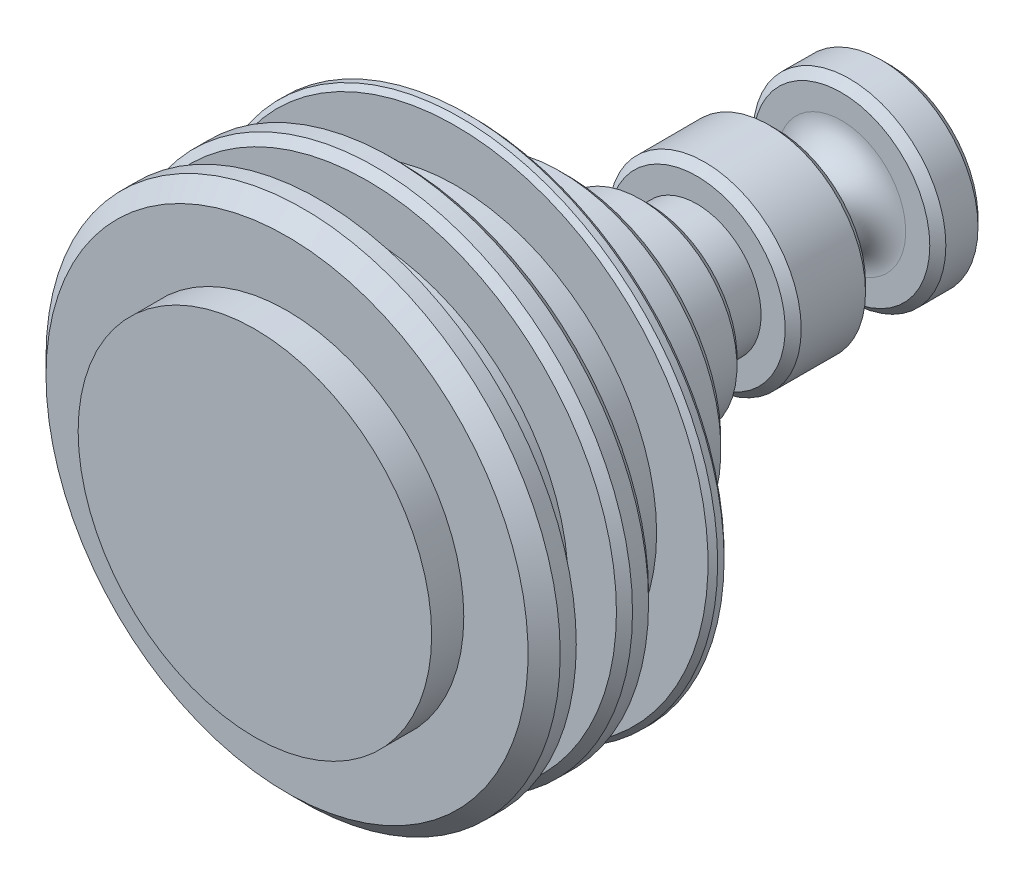
ISO-10303-21;
HEADER;
FILE_DESCRIPTION(('STEP AP214'),'2;1');
FILE_NAME('part.step','',(''),(''),'','','');
FILE_SCHEMA(('AUTOMOTIVE_DESIGN { 1 0 10303 214 1 1 1 1 }'));
ENDSEC;
DATA;
#1=APPLICATION_CONTEXT('core data for automotive mechanical design processes');
#2=APPLICATION_PROTOCOL_DEFINITION('international standard','automotive_design',2000,#1);
#3=PRODUCT_CONTEXT('',#1,'mechanical');
#4=PRODUCT('Part','Part','',(#3));
#5=PRODUCT_RELATED_PRODUCT_CATEGORY('part','',(#4));
#6=PRODUCT_DEFINITION_FORMATION('','',#4);
#7=PRODUCT_DEFINITION_CONTEXT('part definition',#1,'design');
#8=PRODUCT_DEFINITION('design','',#6,#7);
#9=PRODUCT_DEFINITION_SHAPE('','',#8);
#10=(LENGTH_UNIT() NAMED_UNIT(*) SI_UNIT(.MILLI.,.METRE.));
#11=(NAMED_UNIT(*) PLANE_ANGLE_UNIT() SI_UNIT($,.RADIAN.));
#12=(NAMED_UNIT(*) SI_UNIT($,.STERADIAN.) SOLID_ANGLE_UNIT());
#13=UNCERTAINTY_MEASURE_WITH_UNIT(LENGTH_MEASURE(1.E-05),#10,'distance_accuracy_value','');
#14=(GEOMETRIC_REPRESENTATION_CONTEXT(3) GLOBAL_UNCERTAINTY_ASSIGNED_CONTEXT((#13)) GLOBAL_UNIT_ASSIGNED_CONTEXT((#10,
#11,#12)) REPRESENTATION_CONTEXT('',''));
#15=CARTESIAN_POINT('',(0.,0.,0.));
#16=DIRECTION('',(0.,0.,1.));
#17=DIRECTION('',(1.,0.,0.));
#18=AXIS2_PLACEMENT_3D('',#15,#16,#17);
#19=CARTESIAN_POINT('',(-10.4857690202518,0.,-30.5));
#20=DIRECTION('',(0.,0.,1.));
#21=DIRECTION('',(1.,0.,0.));
#22=AXIS2_PLACEMENT_3D('',#19,#20,#21);
#23=PLANE('',#22);
#24=CARTESIAN_POINT('',(0.,0.,-30.5));
#25=DIRECTION('',(0.,0.,1.));
#26=DIRECTION('',(1.,0.,0.));
#27=AXIS2_PLACEMENT_3D('',#24,#25,#26);
#28=CIRCLE('',#27,5.5);
#29=CARTESIAN_POINT('',(5.5,0.,-30.5));
#30=VERTEX_POINT('',#29);
#31=EDGE_CURVE('E85',#30,#30,#28,.F.);
#32=ORIENTED_EDGE('',*,*,#31,.T.);
#33=EDGE_LOOP('',(#32));
#34=FACE_BOUND('',#33,.T.);
#35=CARTESIAN_POINT('',(0.,0.,-30.5));
#36=DIRECTION('',(0.,0.,-1.));
#37=DIRECTION('',(-1.,0.,0.));
#38=AXIS2_PLACEMENT_3D('',#35,#36,#37);
#39=CIRCLE('',#38,4.);
#40=CARTESIAN_POINT('',(-4.,0.,-30.5));
#41=VERTEX_POINT('',#40);
#42=EDGE_CURVE('E151',#41,#41,#39,.T.);
#43=ORIENTED_EDGE('',*,*,#42,.F.);
#44=EDGE_LOOP('',(#43));
#45=FACE_BOUND('',#44,.T.);
#46=ADVANCED_FACE('F41',(#34,#45),#23,.F.);
#47=CARTESIAN_POINT('',(-10.4857690202518,0.,-34.5));
#48=DIRECTION('',(0.,0.,1.));
#49=DIRECTION('',(1.,0.,0.));
#50=AXIS2_PLACEMENT_3D('',#47,#48,#49);
#51=PLANE('',#50);
#52=CARTESIAN_POINT('',(0.,0.,-34.5));
#53=DIRECTION('',(0.,0.,1.));
#54=DIRECTION('',(1.,0.,0.));
#55=AXIS2_PLACEMENT_3D('',#52,#53,#54);
#56=CIRCLE('',#55,5.49999999999999);
#57=CARTESIAN_POINT('',(5.49999999999999,0.,-34.5));
#58=VERTEX_POINT('',#57);
#59=EDGE_CURVE('E94',#58,#58,#56,.T.);
#60=ORIENTED_EDGE('',*,*,#59,.T.);
#61=EDGE_LOOP('',(#60));
#62=FACE_BOUND('',#61,.T.);
#63=CARTESIAN_POINT('',(0.,0.,-34.5));
#64=DIRECTION('',(0.,0.,-1.));
#65=DIRECTION('',(-1.,0.,0.));
#66=AXIS2_PLACEMENT_3D('',#63,#64,#65);
#67=CIRCLE('',#66,4.);
#68=CARTESIAN_POINT('',(-4.,0.,-34.5));
#69=VERTEX_POINT('',#68);
#70=EDGE_CURVE('E154',#69,#69,#67,.T.);
#71=ORIENTED_EDGE('',*,*,#70,.T.);
#72=EDGE_LOOP('',(#71));
#73=FACE_BOUND('',#72,.T.);
#74=ADVANCED_FACE('F158',(#62,#73),#51,.T.);
#75=CARTESIAN_POINT('',(0.,0.,-32.5));
#76=DIRECTION('',(0.,0.,-1.));
#77=DIRECTION('',(-1.,0.,0.));
#78=AXIS2_PLACEMENT_3D('',#75,#76,#77);
#79=TOROIDAL_SURFACE('',#78,4.,2.);
#80=ORIENTED_EDGE('',*,*,#42,.T.);
#81=EDGE_LOOP('',(#80));
#82=FACE_BOUND('',#81,.T.);
#83=ORIENTED_EDGE('',*,*,#70,.F.);
#84=EDGE_LOOP('',(#83));
#85=FACE_BOUND('',#84,.T.);
#86=ADVANCED_FACE('F160',(#82,#85),#79,.F.);
#87=CARTESIAN_POINT('',(0.,0.,-37.5));
#88=DIRECTION('',(0.,0.,-1.));
#89=DIRECTION('',(-1.,0.,0.));
#90=AXIS2_PLACEMENT_3D('',#87,#88,#89);
#91=PLANE('',#90);
#92=CARTESIAN_POINT('',(0.,0.,-37.5));
#93=DIRECTION('',(0.,0.,-1.));
#94=DIRECTION('',(-1.,0.,0.));
#95=AXIS2_PLACEMENT_3D('',#92,#93,#94);
#96=CIRCLE('',#95,5.49999999999999);
#97=CARTESIAN_POINT('',(-5.49999999999999,0.,-37.5));
#98=VERTEX_POINT('',#97);
#99=EDGE_CURVE('E103',#98,#98,#96,.T.);
#100=ORIENTED_EDGE('',*,*,#99,.T.);
#101=EDGE_LOOP('',(#100));
#102=FACE_BOUND('',#101,.T.);
#103=ADVANCED_FACE('F162',(#102),#91,.T.);
#104=CARTESIAN_POINT('',(0.,0.,-37.5));
#105=DIRECTION('',(0.,0.,1.));
#106=DIRECTION('',(1.,0.,0.));
#107=AXIS2_PLACEMENT_3D('',#104,#105,#106);
#108=CYLINDRICAL_SURFACE('',#107,6.);
#109=CARTESIAN_POINT('',(0.,0.,-37.));
#110=DIRECTION('',(0.,0.,-1.));
#111=DIRECTION('',(-1.,0.,0.));
#112=AXIS2_PLACEMENT_3D('',#109,#110,#111);
#113=CIRCLE('',#112,6.);
#114=CARTESIAN_POINT('',(-6.,0.,-37.));
#115=VERTEX_POINT('',#114);
#116=EDGE_CURVE('E97',#115,#115,#113,.F.);
#117=ORIENTED_EDGE('',*,*,#116,.T.);
#118=EDGE_LOOP('',(#117));
#119=FACE_BOUND('',#118,.T.);
#120=CARTESIAN_POINT('',(0.,0.,-35.));
#121=DIRECTION('',(0.,0.,1.));
#122=DIRECTION('',(1.,0.,0.));
#123=AXIS2_PLACEMENT_3D('',#120,#121,#122);
#124=CIRCLE('',#123,6.);
#125=CARTESIAN_POINT('',(6.,0.,-35.));
#126=VERTEX_POINT('',#125);
#127=EDGE_CURVE('E100',#126,#126,#124,.F.);
#128=ORIENTED_EDGE('',*,*,#127,.T.);
#129=EDGE_LOOP('',(#128));
#130=FACE_BOUND('',#129,.T.);
#131=ADVANCED_FACE('F169',(#119,#130),#108,.T.);
#132=CARTESIAN_POINT('',(0.,0.,-25.5));
#133=DIRECTION('',(0.,0.,-1.));
#134=DIRECTION('',(-1.,0.,0.));
#135=AXIS2_PLACEMENT_3D('',#132,#133,#134);
#136=PLANE('',#135);
#137=CARTESIAN_POINT('',(0.,0.,-25.5));
#138=DIRECTION('',(0.,0.,-1.));
#139=DIRECTION('',(-1.,0.,0.));
#140=AXIS2_PLACEMENT_3D('',#137,#138,#139);
#141=CIRCLE('',#140,5.5);
#142=CARTESIAN_POINT('',(-5.5,0.,-25.5));
#143=VERTEX_POINT('',#142);
#144=EDGE_CURVE('E82',#143,#143,#141,.F.);
#145=ORIENTED_EDGE('',*,*,#144,.T.);
#146=EDGE_LOOP('',(#145));
#147=FACE_BOUND('',#146,.T.);
#148=CARTESIAN_POINT('',(0.,0.,-25.5));
#149=DIRECTION('',(0.,0.,-1.));
#150=DIRECTION('',(-1.,0.,0.));
#151=AXIS2_PLACEMENT_3D('',#148,#149,#150);
#152=CIRCLE('',#151,4.);
#153=CARTESIAN_POINT('',(-4.,0.,-25.5));
#154=VERTEX_POINT('',#153);
#155=EDGE_CURVE('E145',#154,#154,#152,.T.);
#156=ORIENTED_EDGE('',*,*,#155,.T.);
#157=EDGE_LOOP('',(#156));
#158=FACE_BOUND('',#157,.T.);
#159=ADVANCED_FACE('F422',(#147,#158),#136,.F.);
#160=CARTESIAN_POINT('',(0.,0.,-30.));
#161=DIRECTION('',(0.,0.,1.));
#162=DIRECTION('',(1.,0.,0.));
#163=AXIS2_PLACEMENT_3D('',#160,#161,#162);
#164=CIRCLE('',#163,6.);
#165=CARTESIAN_POINT('',(6.,0.,-30.));
#166=VERTEX_POINT('',#165);
#167=EDGE_CURVE('E88',#166,#166,#164,.T.);
#168=ORIENTED_EDGE('',*,*,#167,.T.);
#169=EDGE_LOOP('',(#168));
#170=FACE_BOUND('',#169,.T.);
#171=CARTESIAN_POINT('',(0.,0.,-26.));
#172=DIRECTION('',(0.,0.,-1.));
#173=DIRECTION('',(-1.,0.,0.));
#174=AXIS2_PLACEMENT_3D('',#171,#172,#173);
#175=CIRCLE('',#174,6.);
#176=CARTESIAN_POINT('',(-6.,0.,-26.));
#177=VERTEX_POINT('',#176);
#178=EDGE_CURVE('E91',#177,#177,#175,.T.);
#179=ORIENTED_EDGE('',*,*,#178,.T.);
#180=EDGE_LOOP('',(#179));
#181=FACE_BOUND('',#180,.T.);
#182=ADVANCED_FACE('F414',(#170,#181),#108,.T.);
#183=CARTESIAN_POINT('',(0.,0.,-22.5));
#184=DIRECTION('',(0.,0.,-1.));
#185=DIRECTION('',(-1.,0.,0.));
#186=AXIS2_PLACEMENT_3D('',#183,#184,#185);
#187=PLANE('',#186);
#188=CARTESIAN_POINT('',(0.,0.,-22.5));
#189=DIRECTION('',(0.,0.,-1.));
#190=DIRECTION('',(-1.,0.,0.));
#191=AXIS2_PLACEMENT_3D('',#188,#189,#190);
#192=CIRCLE('',#191,5.49999999999999);
#193=CARTESIAN_POINT('',(-5.49999999999999,0.,-22.5));
#194=VERTEX_POINT('',#193);
#195=EDGE_CURVE('E79',#194,#194,#192,.T.);
#196=ORIENTED_EDGE('',*,*,#195,.T.);
#197=EDGE_LOOP('',(#196));
#198=FACE_BOUND('',#197,.T.);
#199=CARTESIAN_POINT('',(0.,0.,-22.5));
#200=DIRECTION('',(0.,0.,-1.));
#201=DIRECTION('',(-1.,0.,0.));
#202=AXIS2_PLACEMENT_3D('',#199,#200,#201);
#203=CIRCLE('',#202,4.);
#204=CARTESIAN_POINT('',(-4.,0.,-22.5));
#205=VERTEX_POINT('',#204);
#206=EDGE_CURVE('E148',#205,#205,#203,.T.);
#207=ORIENTED_EDGE('',*,*,#206,.F.);
#208=EDGE_LOOP('',(#207));
#209=FACE_BOUND('',#208,.T.);
#210=ADVANCED_FACE('F406',(#198,#209),#187,.T.);
#211=CARTESIAN_POINT('',(0.,0.,-17.5));
#212=DIRECTION('',(0.,0.,-1.));
#213=DIRECTION('',(-1.,0.,0.));
#214=AXIS2_PLACEMENT_3D('',#211,#212,#213);
#215=PLANE('',#214);
#216=CARTESIAN_POINT('',(0.,0.,-17.5));
#217=DIRECTION('',(0.,0.,-1.));
#218=DIRECTION('',(-1.,0.,0.));
#219=AXIS2_PLACEMENT_3D('',#216,#217,#218);
#220=CIRCLE('',#219,9.49999999999999);
#221=CARTESIAN_POINT('',(-9.49999999999999,0.,-17.5));
#222=VERTEX_POINT('',#221);
#223=EDGE_CURVE('E73',#222,#222,#220,.T.);
#224=ORIENTED_EDGE('',*,*,#223,.T.);
#225=EDGE_LOOP('',(#224));
#226=FACE_BOUND('',#225,.T.);
#227=CARTESIAN_POINT('',(0.,0.,-17.5));
#228=DIRECTION('',(0.,0.,-1.));
#229=DIRECTION('',(-1.,0.,0.));
#230=AXIS2_PLACEMENT_3D('',#227,#228,#229);
#231=CIRCLE('',#230,6.);
#232=CARTESIAN_POINT('',(-6.,0.,-17.5));
#233=VERTEX_POINT('',#232);
#234=EDGE_CURVE('E142',#233,#233,#231,.T.);
#235=ORIENTED_EDGE('',*,*,#234,.F.);
#236=EDGE_LOOP('',(#235));
#237=FACE_BOUND('',#236,.T.);
#238=ADVANCED_FACE('F398',(#226,#237),#215,.T.);
#239=CARTESIAN_POINT('',(0.,0.,-11.5));
#240=DIRECTION('',(0.,0.,-1.));
#241=DIRECTION('',(-1.,0.,0.));
#242=AXIS2_PLACEMENT_3D('',#239,#240,#241);
#243=PLANE('',#242);
#244=CARTESIAN_POINT('',(0.,0.,-11.5));
#245=DIRECTION('',(0.,0.,-1.));
#246=DIRECTION('',(-1.,0.,0.));
#247=AXIS2_PLACEMENT_3D('',#244,#245,#246);
#248=CIRCLE('',#247,15.7);
#249=CARTESIAN_POINT('',(-15.7,0.,-11.5));
#250=VERTEX_POINT('',#249);
#251=EDGE_CURVE('E64',#250,#250,#248,.T.);
#252=ORIENTED_EDGE('',*,*,#251,.T.);
#253=EDGE_LOOP('',(#252));
#254=FACE_BOUND('',#253,.T.);
#255=CARTESIAN_POINT('',(0.,0.,-11.5));
#256=DIRECTION('',(0.,0.,-1.));
#257=DIRECTION('',(-1.,0.,0.));
#258=AXIS2_PLACEMENT_3D('',#255,#256,#257);
#259=CIRCLE('',#258,10.);
#260=CARTESIAN_POINT('',(-10.,0.,-11.5));
#261=VERTEX_POINT('',#260);
#262=EDGE_CURVE('E139',#261,#261,#259,.T.);
#263=ORIENTED_EDGE('',*,*,#262,.F.);
#264=EDGE_LOOP('',(#263));
#265=FACE_BOUND('',#264,.T.);
#266=ADVANCED_FACE('F390',(#254,#265),#243,.T.);
#267=CARTESIAN_POINT('',(0.,0.,-10.5));
#268=DIRECTION('',(0.,0.,-1.));
#269=DIRECTION('',(-1.,0.,0.));
#270=AXIS2_PLACEMENT_3D('',#267,#268,#269);
#271=PLANE('',#270);
#272=CARTESIAN_POINT('',(0.,0.,-10.5));
#273=DIRECTION('',(0.,0.,-1.));
#274=DIRECTION('',(-1.,0.,0.));
#275=AXIS2_PLACEMENT_3D('',#272,#273,#274);
#276=CIRCLE('',#275,15.7);
#277=CARTESIAN_POINT('',(-15.7,0.,-10.5));
#278=VERTEX_POINT('',#277);
#279=EDGE_CURVE('E52',#278,#278,#276,.F.);
#280=ORIENTED_EDGE('',*,*,#279,.T.);
#281=EDGE_LOOP('',(#280));
#282=FACE_BOUND('',#281,.T.);
#283=CARTESIAN_POINT('',(0.,0.,-10.5));
#284=DIRECTION('',(0.,0.,-1.));
#285=DIRECTION('',(-1.,0.,0.));
#286=AXIS2_PLACEMENT_3D('',#283,#284,#285);
#287=CIRCLE('',#286,12.5);
#288=CARTESIAN_POINT('',(-12.5,0.,-10.5));
#289=VERTEX_POINT('',#288);
#290=EDGE_CURVE('E136',#289,#289,#287,.T.);
#291=ORIENTED_EDGE('',*,*,#290,.T.);
#292=EDGE_LOOP('',(#291));
#293=FACE_BOUND('',#292,.T.);
#294=ADVANCED_FACE('F382',(#282,#293),#271,.F.);
#295=CARTESIAN_POINT('',(0.,0.,-11.5));
#296=DIRECTION('',(0.,0.,1.));
#297=DIRECTION('',(1.,0.,0.));
#298=AXIS2_PLACEMENT_3D('',#295,#296,#297);
#299=CYLINDRICAL_SURFACE('',#298,16.);
#300=CARTESIAN_POINT('',(0.,0.,-11.2));
#301=DIRECTION('',(0.,0.,-1.));
#302=DIRECTION('',(-1.,0.,0.));
#303=AXIS2_PLACEMENT_3D('',#300,#301,#302);
#304=CIRCLE('',#303,16.);
#305=CARTESIAN_POINT('',(-16.,0.,-11.2));
#306=VERTEX_POINT('',#305);
#307=EDGE_CURVE('E56',#306,#306,#304,.F.);
#308=ORIENTED_EDGE('',*,*,#307,.T.);
#309=EDGE_LOOP('',(#308));
#310=FACE_BOUND('',#309,.T.);
#311=CARTESIAN_POINT('',(0.,0.,-10.8));
#312=DIRECTION('',(0.,0.,-1.));
#313=DIRECTION('',(-1.,0.,0.));
#314=AXIS2_PLACEMENT_3D('',#311,#312,#313);
#315=CIRCLE('',#314,16.);
#316=CARTESIAN_POINT('',(-16.,0.,-10.8));
#317=VERTEX_POINT('',#316);
#318=EDGE_CURVE('E61',#317,#317,#315,.T.);
#319=ORIENTED_EDGE('',*,*,#318,.T.);
#320=EDGE_LOOP('',(#319));
#321=FACE_BOUND('',#320,.T.);
#322=ADVANCED_FACE('F374',(#310,#321),#299,.T.);
#323=CARTESIAN_POINT('',(0.,0.,-7.));
#324=DIRECTION('',(0.,0.,-1.));
#325=DIRECTION('',(-1.,0.,0.));
#326=AXIS2_PLACEMENT_3D('',#323,#324,#325);
#327=PLANE('',#326);
#328=CARTESIAN_POINT('',(0.,0.,-7.));
#329=DIRECTION('',(0.,0.,-1.));
#330=DIRECTION('',(-1.,0.,0.));
#331=AXIS2_PLACEMENT_3D('',#328,#329,#330);
#332=CIRCLE('',#331,13.);
#333=CARTESIAN_POINT('',(-13.,0.,-7.));
#334=VERTEX_POINT('',#333);
#335=EDGE_CURVE('E112',#334,#334,#332,.F.);
#336=ORIENTED_EDGE('',*,*,#335,.T.);
#337=EDGE_LOOP('',(#336));
#338=FACE_BOUND('',#337,.T.);
#339=CARTESIAN_POINT('',(0.,0.,-7.));
#340=DIRECTION('',(0.,0.,-1.));
#341=DIRECTION('',(-1.,0.,0.));
#342=AXIS2_PLACEMENT_3D('',#339,#340,#341);
#343=CIRCLE('',#342,15.5);
#344=CARTESIAN_POINT('',(-15.5,0.,-7.));
#345=VERTEX_POINT('',#344);
#346=EDGE_CURVE('E115',#345,#345,#343,.T.);
#347=ORIENTED_EDGE('',*,*,#346,.T.);
#348=EDGE_LOOP('',(#347));
#349=FACE_BOUND('',#348,.T.);
#350=ADVANCED_FACE('F366',(#338,#349),#327,.T.);
#351=CARTESIAN_POINT('',(0.,0.,-5.));
#352=DIRECTION('',(0.,0.,-1.));
#353=DIRECTION('',(-1.,0.,0.));
#354=AXIS2_PLACEMENT_3D('',#351,#352,#353);
#355=PLANE('',#354);
#356=CARTESIAN_POINT('',(0.,0.,-5.));
#357=DIRECTION('',(0.,0.,-1.));
#358=DIRECTION('',(-1.,0.,0.));
#359=AXIS2_PLACEMENT_3D('',#356,#357,#358);
#360=CIRCLE('',#359,15.5);
#361=CARTESIAN_POINT('',(-15.5,0.,-5.));
#362=VERTEX_POINT('',#361);
#363=EDGE_CURVE('E67',#362,#362,#360,.F.);
#364=ORIENTED_EDGE('',*,*,#363,.T.);
#365=EDGE_LOOP('',(#364));
#366=FACE_BOUND('',#365,.T.);
#367=CARTESIAN_POINT('',(0.,0.,-5.));
#368=DIRECTION('',(0.,0.,-1.));
#369=DIRECTION('',(-1.,0.,0.));
#370=AXIS2_PLACEMENT_3D('',#367,#368,#369);
#371=CIRCLE('',#370,12.5);
#372=CARTESIAN_POINT('',(-12.5,0.,-5.));
#373=VERTEX_POINT('',#372);
#374=EDGE_CURVE('E130',#373,#373,#371,.T.);
#375=ORIENTED_EDGE('',*,*,#374,.T.);
#376=EDGE_LOOP('',(#375));
#377=FACE_BOUND('',#376,.T.);
#378=ADVANCED_FACE('F358',(#366,#377),#355,.F.);
#379=CARTESIAN_POINT('',(0.,0.,-7.));
#380=DIRECTION('',(0.,0.,1.));
#381=DIRECTION('',(1.,0.,0.));
#382=AXIS2_PLACEMENT_3D('',#379,#380,#381);
#383=CYLINDRICAL_SURFACE('',#382,16.);
#384=CARTESIAN_POINT('',(0.,0.,-6.5));
#385=DIRECTION('',(0.,0.,-1.));
#386=DIRECTION('',(-1.,0.,0.));
#387=AXIS2_PLACEMENT_3D('',#384,#385,#386);
#388=CIRCLE('',#387,16.);
#389=CARTESIAN_POINT('',(-16.,0.,-6.5));
#390=VERTEX_POINT('',#389);
#391=EDGE_CURVE('E106',#390,#390,#388,.F.);
#392=ORIENTED_EDGE('',*,*,#391,.T.);
#393=EDGE_LOOP('',(#392));
#394=FACE_BOUND('',#393,.T.);
#395=CARTESIAN_POINT('',(0.,0.,-5.50000000000001));
#396=DIRECTION('',(0.,0.,-1.));
#397=DIRECTION('',(-1.,0.,0.));
#398=AXIS2_PLACEMENT_3D('',#395,#396,#397);
#399=CIRCLE('',#398,16.);
#400=CARTESIAN_POINT('',(-16.,0.,-5.50000000000001));
#401=VERTEX_POINT('',#400);
#402=EDGE_CURVE('E109',#401,#401,#399,.T.);
#403=ORIENTED_EDGE('',*,*,#402,.T.);
#404=EDGE_LOOP('',(#403));
#405=FACE_BOUND('',#404,.T.);
#406=ADVANCED_FACE('F350',(#394,#405),#383,.T.);
#407=CARTESIAN_POINT('',(0.,0.,-2.));
#408=DIRECTION('',(0.,0.,-1.));
#409=DIRECTION('',(-1.,0.,0.));
#410=AXIS2_PLACEMENT_3D('',#407,#408,#409);
#411=PLANE('',#410);
#412=CARTESIAN_POINT('',(0.,0.,-2.));
#413=DIRECTION('',(0.,0.,-1.));
#414=DIRECTION('',(-1.,0.,0.));
#415=AXIS2_PLACEMENT_3D('',#412,#413,#414);
#416=CIRCLE('',#415,16.);
#417=CARTESIAN_POINT('',(-16.,0.,-2.));
#418=VERTEX_POINT('',#417);
#419=EDGE_CURVE('E127',#418,#418,#416,.T.);
#420=ORIENTED_EDGE('',*,*,#419,.T.);
#421=EDGE_LOOP('',(#420));
#422=FACE_BOUND('',#421,.T.);
#423=CARTESIAN_POINT('',(0.,0.,-2.));
#424=DIRECTION('',(0.,0.,-1.));
#425=DIRECTION('',(-1.,0.,0.));
#426=AXIS2_PLACEMENT_3D('',#423,#424,#425);
#427=CIRCLE('',#426,12.5);
#428=CARTESIAN_POINT('',(-12.5,0.,-2.));
#429=VERTEX_POINT('',#428);
#430=EDGE_CURVE('E133',#429,#429,#427,.T.);
#431=ORIENTED_EDGE('',*,*,#430,.F.);
#432=EDGE_LOOP('',(#431));
#433=FACE_BOUND('',#432,.T.);
#434=ADVANCED_FACE('F338',(#422,#433),#411,.T.);
#435=CARTESIAN_POINT('',(0.,0.,2.));
#436=DIRECTION('',(0.,0.,-1.));
#437=DIRECTION('',(-1.,0.,0.));
#438=AXIS2_PLACEMENT_3D('',#435,#436,#437);
#439=CYLINDRICAL_SURFACE('',#438,11.);
#440=CARTESIAN_POINT('',(0.,0.,2.));
#441=DIRECTION('',(0.,0.,1.));
#442=DIRECTION('',(1.,0.,0.));
#443=AXIS2_PLACEMENT_3D('',#440,#441,#442);
#444=CIRCLE('',#443,11.);
#445=CARTESIAN_POINT('',(11.,0.,2.));
#446=VERTEX_POINT('',#445);
#447=EDGE_CURVE('E121',#446,#446,#444,.T.);
#448=ORIENTED_EDGE('',*,*,#447,.F.);
#449=EDGE_LOOP('',(#448));
#450=FACE_BOUND('',#449,.T.);
#451=CARTESIAN_POINT('',(0.,0.,0.));
#452=DIRECTION('',(0.,0.,-1.));
#453=DIRECTION('',(-1.,0.,0.));
#454=AXIS2_PLACEMENT_3D('',#451,#452,#453);
#455=CIRCLE('',#454,11.);
#456=CARTESIAN_POINT('',(-11.,0.,0.));
#457=VERTEX_POINT('',#456);
#458=EDGE_CURVE('E124',#457,#457,#455,.T.);
#459=ORIENTED_EDGE('',*,*,#458,.F.);
#460=EDGE_LOOP('',(#459));
#461=FACE_BOUND('',#460,.T.);
#462=ADVANCED_FACE('F43',(#450,#461),#439,.T.);
#463=CARTESIAN_POINT('',(0.,0.,2.));
#464=DIRECTION('',(0.,0.,1.));
#465=DIRECTION('',(1.,0.,0.));
#466=AXIS2_PLACEMENT_3D('',#463,#464,#465);
#467=PLANE('',#466);
#468=ORIENTED_EDGE('',*,*,#447,.T.);
#469=EDGE_LOOP('',(#468));
#470=FACE_BOUND('',#469,.T.);
#471=ADVANCED_FACE('F330',(#470),#467,.T.);
#472=CARTESIAN_POINT('',(0.,0.,0.));
#473=DIRECTION('',(0.,0.,-1.));
#474=DIRECTION('',(-1.,0.,0.));
#475=AXIS2_PLACEMENT_3D('',#472,#473,#474);
#476=PLANE('',#475);
#477=CARTESIAN_POINT('',(0.,0.,0.));
#478=DIRECTION('',(0.,0.,-1.));
#479=DIRECTION('',(-1.,0.,0.));
#480=AXIS2_PLACEMENT_3D('',#477,#478,#479);
#481=CIRCLE('',#480,15.);
#482=CARTESIAN_POINT('',(-15.,0.,0.));
#483=VERTEX_POINT('',#482);
#484=EDGE_CURVE('E12',#483,#483,#481,.F.);
#485=ORIENTED_EDGE('',*,*,#484,.T.);
#486=EDGE_LOOP('',(#485));
#487=FACE_BOUND('',#486,.T.);
#488=ORIENTED_EDGE('',*,*,#458,.T.);
#489=EDGE_LOOP('',(#488));
#490=FACE_BOUND('',#489,.T.);
#491=ADVANCED_FACE('F323',(#487,#490),#476,.F.);
#492=CARTESIAN_POINT('',(0.,0.,-2.));
#493=DIRECTION('',(0.,0.,1.));
#494=DIRECTION('',(1.,0.,0.));
#495=AXIS2_PLACEMENT_3D('',#492,#493,#494);
#496=CYLINDRICAL_SURFACE('',#495,16.);
#497=CARTESIAN_POINT('',(0.,0.,-1.00000000000002));
#498=DIRECTION('',(0.,0.,-1.));
#499=DIRECTION('',(-1.,0.,0.));
#500=AXIS2_PLACEMENT_3D('',#497,#498,#499);
#501=CIRCLE('',#500,16.);
#502=CARTESIAN_POINT('',(-16.,0.,-1.00000000000002));
#503=VERTEX_POINT('',#502);
#504=EDGE_CURVE('E48',#503,#503,#501,.T.);
#505=ORIENTED_EDGE('',*,*,#504,.T.);
#506=EDGE_LOOP('',(#505));
#507=FACE_BOUND('',#506,.T.);
#508=ORIENTED_EDGE('',*,*,#419,.F.);
#509=EDGE_LOOP('',(#508));
#510=FACE_BOUND('',#509,.T.);
#511=ADVANCED_FACE('F315',(#507,#510),#496,.T.);
#512=CARTESIAN_POINT('',(0.,0.,-5.));
#513=DIRECTION('',(0.,0.,1.));
#514=DIRECTION('',(1.,0.,0.));
#515=AXIS2_PLACEMENT_3D('',#512,#513,#514);
#516=CYLINDRICAL_SURFACE('',#515,12.5);
#517=ORIENTED_EDGE('',*,*,#374,.F.);
#518=EDGE_LOOP('',(#517));
#519=FACE_BOUND('',#518,.T.);
#520=ORIENTED_EDGE('',*,*,#430,.T.);
#521=EDGE_LOOP('',(#520));
#522=FACE_BOUND('',#521,.T.);
#523=ADVANCED_FACE('F307',(#519,#522),#516,.T.);
#524=CARTESIAN_POINT('',(0.,0.,-10.5));
#525=DIRECTION('',(0.,0.,1.));
#526=DIRECTION('',(1.,0.,0.));
#527=AXIS2_PLACEMENT_3D('',#524,#525,#526);
#528=CYLINDRICAL_SURFACE('',#527,12.5);
#529=CARTESIAN_POINT('',(0.,0.,-7.50000000000001));
#530=DIRECTION('',(0.,0.,-1.));
#531=DIRECTION('',(-1.,0.,0.));
#532=AXIS2_PLACEMENT_3D('',#529,#530,#531);
#533=CIRCLE('',#532,12.5);
#534=CARTESIAN_POINT('',(-12.5,0.,-7.50000000000001));
#535=VERTEX_POINT('',#534);
#536=EDGE_CURVE('E118',#535,#535,#533,.T.);
#537=ORIENTED_EDGE('',*,*,#536,.T.);
#538=EDGE_LOOP('',(#537));
#539=FACE_BOUND('',#538,.T.);
#540=ORIENTED_EDGE('',*,*,#290,.F.);
#541=EDGE_LOOP('',(#540));
#542=FACE_BOUND('',#541,.T.);
#543=ADVANCED_FACE('F299',(#539,#542),#528,.T.);
#544=CARTESIAN_POINT('',(0.,0.,-17.5));
#545=DIRECTION('',(0.,0.,1.));
#546=DIRECTION('',(1.,0.,0.));
#547=AXIS2_PLACEMENT_3D('',#544,#545,#546);
#548=CYLINDRICAL_SURFACE('',#547,10.);
#549=CARTESIAN_POINT('',(0.,0.,-17.));
#550=DIRECTION('',(0.,0.,-1.));
#551=DIRECTION('',(-1.,0.,0.));
#552=AXIS2_PLACEMENT_3D('',#549,#550,#551);
#553=CIRCLE('',#552,10.);
#554=CARTESIAN_POINT('',(-10.,0.,-17.));
#555=VERTEX_POINT('',#554);
#556=EDGE_CURVE('E70',#555,#555,#553,.F.);
#557=ORIENTED_EDGE('',*,*,#556,.T.);
#558=EDGE_LOOP('',(#557));
#559=FACE_BOUND('',#558,.T.);
#560=ORIENTED_EDGE('',*,*,#262,.T.);
#561=EDGE_LOOP('',(#560));
#562=FACE_BOUND('',#561,.T.);
#563=ADVANCED_FACE('F291',(#559,#562),#548,.T.);
#564=CARTESIAN_POINT('',(0.,0.,-22.5));
#565=DIRECTION('',(0.,0.,1.));
#566=DIRECTION('',(1.,0.,0.));
#567=AXIS2_PLACEMENT_3D('',#564,#565,#566);
#568=CYLINDRICAL_SURFACE('',#567,6.);
#569=CARTESIAN_POINT('',(0.,0.,-22.));
#570=DIRECTION('',(0.,0.,-1.));
#571=DIRECTION('',(-1.,0.,0.));
#572=AXIS2_PLACEMENT_3D('',#569,#570,#571);
#573=CIRCLE('',#572,6.);
#574=CARTESIAN_POINT('',(-6.,0.,-22.));
#575=VERTEX_POINT('',#574);
#576=EDGE_CURVE('E76',#575,#575,#573,.F.);
#577=ORIENTED_EDGE('',*,*,#576,.T.);
#578=EDGE_LOOP('',(#577));
#579=FACE_BOUND('',#578,.T.);
#580=ORIENTED_EDGE('',*,*,#234,.T.);
#581=EDGE_LOOP('',(#580));
#582=FACE_BOUND('',#581,.T.);
#583=ADVANCED_FACE('F283',(#579,#582),#568,.T.);
#584=CARTESIAN_POINT('',(0.,0.,-25.5));
#585=DIRECTION('',(0.,0.,1.));
#586=DIRECTION('',(1.,0.,0.));
#587=AXIS2_PLACEMENT_3D('',#584,#585,#586);
#588=CYLINDRICAL_SURFACE('',#587,4.);
#589=ORIENTED_EDGE('',*,*,#155,.F.);
#590=EDGE_LOOP('',(#589));
#591=FACE_BOUND('',#590,.T.);
#592=ORIENTED_EDGE('',*,*,#206,.T.);
#593=EDGE_LOOP('',(#592));
#594=FACE_BOUND('',#593,.T.);
#595=ADVANCED_FACE('F186',(#591,#594),#588,.T.);
#596=CARTESIAN_POINT('',(0.,0.,-7.50000000000001));
#597=DIRECTION('',(0.,0.,1.));
#598=DIRECTION('',(1.,0.,0.));
#599=AXIS2_PLACEMENT_3D('',#596,#597,#598);
#600=CONICAL_SURFACE('',#599,12.5,0.785398163397443);
#601=ORIENTED_EDGE('',*,*,#335,.F.);
#602=EDGE_LOOP('',(#601));
#603=FACE_BOUND('',#602,.T.);
#604=ORIENTED_EDGE('',*,*,#536,.F.);
#605=EDGE_LOOP('',(#604));
#606=FACE_BOUND('',#605,.T.);
#607=ADVANCED_FACE('F182',(#603,#606),#600,.T.);
#608=CARTESIAN_POINT('',(0.,0.,-7.));
#609=DIRECTION('',(0.,0.,1.));
#610=DIRECTION('',(1.,0.,0.));
#611=AXIS2_PLACEMENT_3D('',#608,#609,#610);
#612=CONICAL_SURFACE('',#611,15.5,0.785398163397453);
#613=ORIENTED_EDGE('',*,*,#391,.F.);
#614=EDGE_LOOP('',(#613));
#615=FACE_BOUND('',#614,.T.);
#616=ORIENTED_EDGE('',*,*,#346,.F.);
#617=EDGE_LOOP('',(#616));
#618=FACE_BOUND('',#617,.T.);
#619=ADVANCED_FACE('F185',(#615,#618),#612,.T.);
#620=CARTESIAN_POINT('',(0.,0.,-37.5));
#621=DIRECTION('',(0.,0.,1.));
#622=DIRECTION('',(1.,0.,0.));
#623=AXIS2_PLACEMENT_3D('',#620,#621,#622);
#624=CONICAL_SURFACE('',#623,5.49999999999999,0.785398163397457);
#625=ORIENTED_EDGE('',*,*,#116,.F.);
#626=EDGE_LOOP('',(#625));
#627=FACE_BOUND('',#626,.T.);
#628=ORIENTED_EDGE('',*,*,#99,.F.);
#629=EDGE_LOOP('',(#628));
#630=FACE_BOUND('',#629,.T.);
#631=ADVANCED_FACE('F190',(#627,#630),#624,.T.);
#632=CARTESIAN_POINT('',(0.,0.,-34.5));
#633=DIRECTION('',(0.,0.,-1.));
#634=DIRECTION('',(-1.,0.,0.));
#635=AXIS2_PLACEMENT_3D('',#632,#633,#634);
#636=CONICAL_SURFACE('',#635,5.49999999999999,0.785398163397457);
#637=ORIENTED_EDGE('',*,*,#127,.F.);
#638=EDGE_LOOP('',(#637));
#639=FACE_BOUND('',#638,.T.);
#640=ORIENTED_EDGE('',*,*,#59,.F.);
#641=EDGE_LOOP('',(#640));
#642=FACE_BOUND('',#641,.T.);
#643=ADVANCED_FACE('F194',(#639,#642),#636,.T.);
#644=CARTESIAN_POINT('',(0.,0.,-30.));
#645=DIRECTION('',(0.,0.,1.));
#646=DIRECTION('',(1.,0.,0.));
#647=AXIS2_PLACEMENT_3D('',#644,#645,#646);
#648=CONICAL_SURFACE('',#647,6.,0.785398163397445);
#649=ORIENTED_EDGE('',*,*,#31,.F.);
#650=EDGE_LOOP('',(#649));
#651=FACE_BOUND('',#650,.T.);
#652=ORIENTED_EDGE('',*,*,#167,.F.);
#653=EDGE_LOOP('',(#652));
#654=FACE_BOUND('',#653,.T.);
#655=ADVANCED_FACE('F198',(#651,#654),#648,.T.);
#656=CARTESIAN_POINT('',(0.,0.,-26.));
#657=DIRECTION('',(0.,0.,-1.));
#658=DIRECTION('',(-1.,0.,0.));
#659=AXIS2_PLACEMENT_3D('',#656,#657,#658);
#660=CONICAL_SURFACE('',#659,6.,0.785398163397445);
#661=ORIENTED_EDGE('',*,*,#144,.F.);
#662=EDGE_LOOP('',(#661));
#663=FACE_BOUND('',#662,.T.);
#664=ORIENTED_EDGE('',*,*,#178,.F.);
#665=EDGE_LOOP('',(#664));
#666=FACE_BOUND('',#665,.T.);
#667=ADVANCED_FACE('F202',(#663,#666),#660,.T.);
#668=CARTESIAN_POINT('',(0.,0.,-22.5));
#669=DIRECTION('',(0.,0.,1.));
#670=DIRECTION('',(1.,0.,0.));
#671=AXIS2_PLACEMENT_3D('',#668,#669,#670);
#672=CONICAL_SURFACE('',#671,5.49999999999999,0.785398163397453);
#673=ORIENTED_EDGE('',*,*,#576,.F.);
#674=EDGE_LOOP('',(#673));
#675=FACE_BOUND('',#674,.T.);
#676=ORIENTED_EDGE('',*,*,#195,.F.);
#677=EDGE_LOOP('',(#676));
#678=FACE_BOUND('',#677,.T.);
#679=ADVANCED_FACE('F206',(#675,#678),#672,.T.);
#680=CARTESIAN_POINT('',(0.,0.,-17.5));
#681=DIRECTION('',(0.,0.,1.));
#682=DIRECTION('',(1.,0.,0.));
#683=AXIS2_PLACEMENT_3D('',#680,#681,#682);
#684=CONICAL_SURFACE('',#683,9.49999999999999,0.785398163397453);
#685=ORIENTED_EDGE('',*,*,#556,.F.);
#686=EDGE_LOOP('',(#685));
#687=FACE_BOUND('',#686,.T.);
#688=ORIENTED_EDGE('',*,*,#223,.F.);
#689=EDGE_LOOP('',(#688));
#690=FACE_BOUND('',#689,.T.);
#691=ADVANCED_FACE('F210',(#687,#690),#684,.T.);
#692=CARTESIAN_POINT('',(0.,0.,-5.50000000000001));
#693=DIRECTION('',(0.,0.,-1.));
#694=DIRECTION('',(-1.,0.,0.));
#695=AXIS2_PLACEMENT_3D('',#692,#693,#694);
#696=CONICAL_SURFACE('',#695,16.,0.785398163397443);
#697=ORIENTED_EDGE('',*,*,#363,.F.);
#698=EDGE_LOOP('',(#697));
#699=FACE_BOUND('',#698,.T.);
#700=ORIENTED_EDGE('',*,*,#402,.F.);
#701=EDGE_LOOP('',(#700));
#702=FACE_BOUND('',#701,.T.);
#703=ADVANCED_FACE('F214',(#699,#702),#696,.T.);
#704=CARTESIAN_POINT('',(0.,0.,-11.5));
#705=DIRECTION('',(0.,0.,1.));
#706=DIRECTION('',(1.,0.,0.));
#707=AXIS2_PLACEMENT_3D('',#704,#705,#706);
#708=CONICAL_SURFACE('',#707,15.7,0.785398163397454);
#709=ORIENTED_EDGE('',*,*,#307,.F.);
#710=EDGE_LOOP('',(#709));
#711=FACE_BOUND('',#710,.T.);
#712=ORIENTED_EDGE('',*,*,#251,.F.);
#713=EDGE_LOOP('',(#712));
#714=FACE_BOUND('',#713,.T.);
#715=ADVANCED_FACE('F218',(#711,#714),#708,.T.);
#716=CARTESIAN_POINT('',(0.,0.,-10.8));
#717=DIRECTION('',(0.,0.,-1.));
#718=DIRECTION('',(-1.,0.,0.));
#719=AXIS2_PLACEMENT_3D('',#716,#717,#718);
#720=CONICAL_SURFACE('',#719,16.,0.785398163397443);
#721=CARTESIAN_POINT('',(-15.7,0.,-10.5));
#722=CARTESIAN_POINT('',(-15.703125,0.,-10.503125));
#723=CARTESIAN_POINT('',(-15.70625,0.,-10.50625));
#724=CARTESIAN_POINT('',(-15.7125,0.,-10.5125));
#725=CARTESIAN_POINT('',(-15.715625,0.,-10.515625));
#726=CARTESIAN_POINT('',(-15.721875,0.,-10.521875));
#727=CARTESIAN_POINT('',(-15.725,0.,-10.525));
#728=CARTESIAN_POINT('',(-15.73125,0.,-10.53125));
#729=CARTESIAN_POINT('',(-15.734375,0.,-10.534375));
#730=CARTESIAN_POINT('',(-15.740625,0.,-10.540625));
#731=CARTESIAN_POINT('',(-15.74375,0.,-10.54375));
#732=CARTESIAN_POINT('',(-15.75,0.,-10.55));
#733=CARTESIAN_POINT('',(-15.753125,0.,-10.553125));
#734=CARTESIAN_POINT('',(-15.759375,0.,-10.559375));
#735=CARTESIAN_POINT('',(-15.7625,0.,-10.5625));
#736=CARTESIAN_POINT('',(-15.76875,0.,-10.56875));
#737=CARTESIAN_POINT('',(-15.771875,0.,-10.571875));
#738=CARTESIAN_POINT('',(-15.778125,0.,-10.578125));
#739=CARTESIAN_POINT('',(-15.78125,0.,-10.58125));
#740=CARTESIAN_POINT('',(-15.7875,0.,-10.5875));
#741=CARTESIAN_POINT('',(-15.790625,0.,-10.590625));
#742=CARTESIAN_POINT('',(-15.796875,0.,-10.596875));
#743=CARTESIAN_POINT('',(-15.8,0.,-10.6));
#744=CARTESIAN_POINT('',(-15.80625,0.,-10.60625));
#745=CARTESIAN_POINT('',(-15.809375,0.,-10.609375));
#746=CARTESIAN_POINT('',(-15.815625,0.,-10.615625));
#747=CARTESIAN_POINT('',(-15.81875,0.,-10.61875));
#748=CARTESIAN_POINT('',(-15.825,0.,-10.625));
#749=CARTESIAN_POINT('',(-15.828125,0.,-10.628125));
#750=CARTESIAN_POINT('',(-15.834375,0.,-10.634375));
#751=CARTESIAN_POINT('',(-15.8375,0.,-10.6375));
#752=CARTESIAN_POINT('',(-15.84375,0.,-10.64375));
#753=CARTESIAN_POINT('',(-15.846875,0.,-10.646875));
#754=CARTESIAN_POINT('',(-15.853125,0.,-10.653125));
#755=CARTESIAN_POINT('',(-15.85625,0.,-10.65625));
#756=CARTESIAN_POINT('',(-15.8625,0.,-10.6625));
#757=CARTESIAN_POINT('',(-15.865625,0.,-10.665625));
#758=CARTESIAN_POINT('',(-15.871875,0.,-10.671875));
#759=CARTESIAN_POINT('',(-15.875,0.,-10.675));
#760=CARTESIAN_POINT('',(-15.88125,0.,-10.68125));
#761=CARTESIAN_POINT('',(-15.884375,0.,-10.684375));
#762=CARTESIAN_POINT('',(-15.890625,0.,-10.690625));
#763=CARTESIAN_POINT('',(-15.89375,0.,-10.69375));
#764=CARTESIAN_POINT('',(-15.9,0.,-10.7));
#765=CARTESIAN_POINT('',(-15.903125,0.,-10.703125));
#766=CARTESIAN_POINT('',(-15.909375,0.,-10.709375));
#767=CARTESIAN_POINT('',(-15.9125,0.,-10.7125));
#768=CARTESIAN_POINT('',(-15.91875,0.,-10.71875));
#769=CARTESIAN_POINT('',(-15.921875,0.,-10.721875));
#770=CARTESIAN_POINT('',(-15.928125,0.,-10.728125));
#771=CARTESIAN_POINT('',(-15.93125,0.,-10.73125));
#772=CARTESIAN_POINT('',(-15.9375,0.,-10.7375));
#773=CARTESIAN_POINT('',(-15.940625,0.,-10.740625));
#774=CARTESIAN_POINT('',(-15.946875,0.,-10.746875));
#775=CARTESIAN_POINT('',(-15.95,0.,-10.75));
#776=CARTESIAN_POINT('',(-15.95625,0.,-10.75625));
#777=CARTESIAN_POINT('',(-15.959375,0.,-10.759375));
#778=CARTESIAN_POINT('',(-15.965625,0.,-10.765625));
#779=CARTESIAN_POINT('',(-15.96875,0.,-10.76875));
#780=CARTESIAN_POINT('',(-15.975,0.,-10.775));
#781=CARTESIAN_POINT('',(-15.978125,0.,-10.778125));
#782=CARTESIAN_POINT('',(-15.984375,0.,-10.784375));
#783=CARTESIAN_POINT('',(-15.9875,0.,-10.7875));
#784=CARTESIAN_POINT('',(-15.99375,0.,-10.79375));
#785=CARTESIAN_POINT('',(-15.996875,0.,-10.796875));
#786=CARTESIAN_POINT('',(-16.,0.,-10.8));
#787=B_SPLINE_CURVE_WITH_KNOTS('',3,(#721,#722,#723,#724,#725,#726,#727,#728,#729,#730,#731,
#732,#733,#734,#735,#736,#737,#738,#739,#740,#741,#742,#743,#744,#745,#746,#747,#748,#749,#750,
#751,#752,#753,#754,#755,#756,#757,#758,#759,#760,#761,#762,#763,#764,#765,#766,#767,#768,#769,
#770,#771,#772,#773,#774,#775,#776,#777,#778,#779,#780,#781,#782,#783,#784,#785,#786),
.UNSPECIFIED.,.F.,.F.,(4,2,2,2,2,2,2,2,2,2,2,2,2,2,2,2,2,2,2,2,2,2,2,2,2,2,2,2,2,2,2,2,4),(0.,
0.0132582521472463,0.0265165042944938,0.0397747564417438,0.0530330085889901,0.0662912607362377,
0.0795495128834876,0.092807765030734,0.106066017177981,0.119324269325231,0.132582521472478,
0.145840773619725,0.159099025766975,0.172357277914222,0.185615530061469,0.198873782208717,
0.212132034355967,0.225390286503213,0.23864853865046,0.25190679079771,0.265165042944957,
0.278423295092204,0.291681547239454,0.304939799386701,0.318198051533948,0.331456303681198,
0.344714555828444,0.357972807975692,0.371231060122942,0.384489312270188,0.397747564417436,
0.411005816564683,0.424264068711933),.UNSPECIFIED.);
#788=EDGE_CURVE('BSEAM222',#278,#317,#787,.T.);
#789=ORIENTED_EDGE('',*,*,#279,.F.);
#790=ORIENTED_EDGE('',*,*,#318,.F.);
#791=ORIENTED_EDGE('',*,*,#788,.T.);
#792=ORIENTED_EDGE('',*,*,#788,.F.);
#793=EDGE_LOOP('',(#789,#791,#790,#792));
#794=FACE_BOUND('',#793,.T.);
#795=ADVANCED_FACE('F222',(#794),#720,.T.);
#796=CARTESIAN_POINT('',(0.,0.,-1.00000000000002));
#797=DIRECTION('',(0.,0.,-1.));
#798=DIRECTION('',(-1.,0.,0.));
#799=AXIS2_PLACEMENT_3D('',#796,#797,#798);
#800=CONICAL_SURFACE('',#799,16.,0.785398163397443);
#801=ORIENTED_EDGE('',*,*,#484,.F.);
#802=EDGE_LOOP('',(#801));
#803=FACE_BOUND('',#802,.T.);
#804=ORIENTED_EDGE('',*,*,#504,.F.);
#805=EDGE_LOOP('',(#804));
#806=FACE_BOUND('',#805,.T.);
#807=ADVANCED_FACE('F226',(#803,#806),#800,.T.);
#808=CLOSED_SHELL('',(#46,#74,#86,#103,#131,#159,#182,#210,#238,#266,#294,#322,#350,#378,#406,
#434,#462,#471,#491,#511,#523,#543,#563,#583,#595,#607,#619,#631,#643,#655,#667,#679,#691,#703,
#715,#795,#807));
#809=MANIFOLD_SOLID_BREP('B2',#808);
#810=ADVANCED_BREP_SHAPE_REPRESENTATION('',(#18,#809),#14);
#811=SHAPE_DEFINITION_REPRESENTATION(#9,#810);
ENDSEC;
END-ISO-10303-21;
